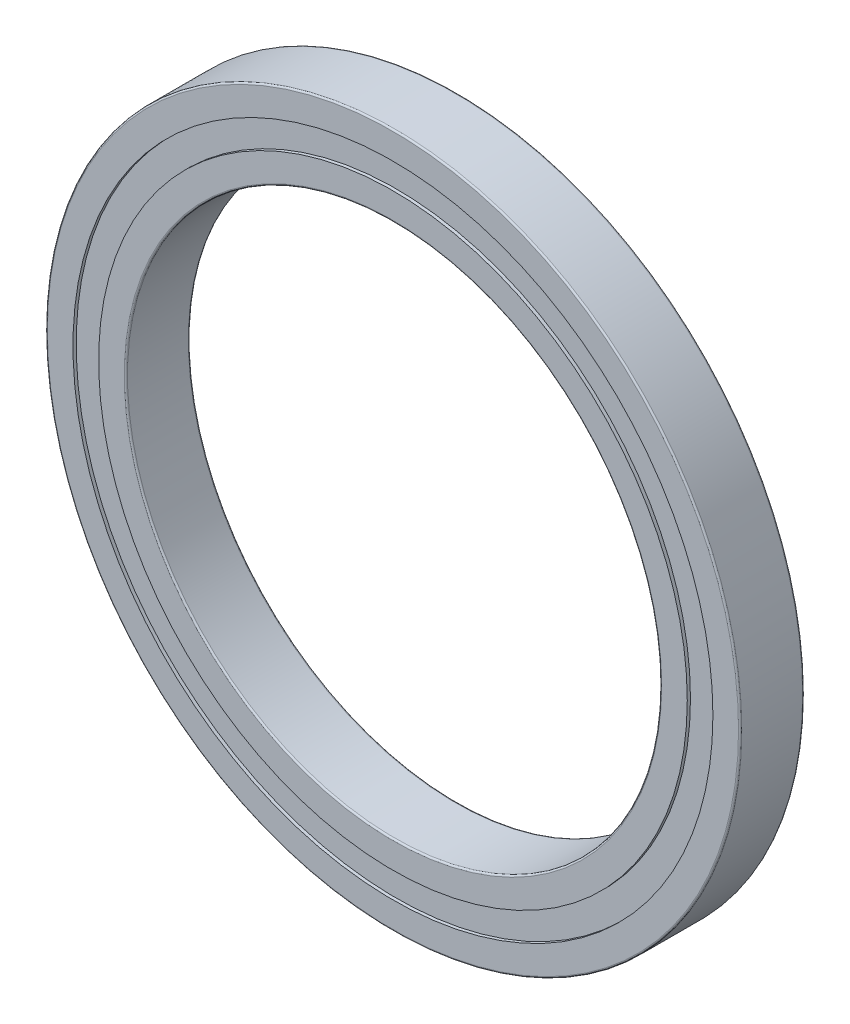
ISO-10303-21;
HEADER;
FILE_DESCRIPTION(('STEP AP214'),'2;1');
FILE_NAME('part.step','',(''),(''),'','','');
FILE_SCHEMA(('AUTOMOTIVE_DESIGN { 1 0 10303 214 1 1 1 1 }'));
ENDSEC;
DATA;
#1=APPLICATION_CONTEXT('core data for automotive mechanical design processes');
#2=APPLICATION_PROTOCOL_DEFINITION('international standard','automotive_design',2000,#1);
#3=PRODUCT_CONTEXT('',#1,'mechanical');
#4=PRODUCT('Part','Part','',(#3));
#5=PRODUCT_RELATED_PRODUCT_CATEGORY('part','',(#4));
#6=PRODUCT_DEFINITION_FORMATION('','',#4);
#7=PRODUCT_DEFINITION_CONTEXT('part definition',#1,'design');
#8=PRODUCT_DEFINITION('design','',#6,#7);
#9=PRODUCT_DEFINITION_SHAPE('','',#8);
#10=(LENGTH_UNIT() NAMED_UNIT(*) SI_UNIT(.MILLI.,.METRE.));
#11=(NAMED_UNIT(*) PLANE_ANGLE_UNIT() SI_UNIT($,.RADIAN.));
#12=(NAMED_UNIT(*) SI_UNIT($,.STERADIAN.) SOLID_ANGLE_UNIT());
#13=UNCERTAINTY_MEASURE_WITH_UNIT(LENGTH_MEASURE(1.E-05),#10,'distance_accuracy_value','');
#14=(GEOMETRIC_REPRESENTATION_CONTEXT(3) GLOBAL_UNCERTAINTY_ASSIGNED_CONTEXT((#13)) GLOBAL_UNIT_ASSIGNED_CONTEXT((#10,
#11,#12)) REPRESENTATION_CONTEXT('',''));
#15=CARTESIAN_POINT('',(0.,0.,0.));
#16=DIRECTION('',(0.,0.,1.));
#17=DIRECTION('',(1.,0.,0.));
#18=AXIS2_PLACEMENT_3D('',#15,#16,#17);
#19=CARTESIAN_POINT('',(0.,0.,0.));
#20=DIRECTION('',(0.,0.,1.));
#21=DIRECTION('',(1.,0.,0.));
#22=AXIS2_PLACEMENT_3D('',#19,#20,#21);
#23=PLANE('',#22);
#24=CARTESIAN_POINT('',(0.,0.,0.));
#25=DIRECTION('',(0.,0.,1.));
#26=DIRECTION('',(1.,0.,0.));
#27=AXIS2_PLACEMENT_3D('',#24,#25,#26);
#28=CIRCLE('',#27,25.15);
#29=CARTESIAN_POINT('',(25.15,0.,0.));
#30=VERTEX_POINT('',#29);
#31=EDGE_CURVE('E62',#30,#30,#28,.T.);
#32=ORIENTED_EDGE('',*,*,#31,.T.);
#33=EDGE_LOOP('',(#32));
#34=FACE_BOUND('',#33,.T.);
#35=CARTESIAN_POINT('',(0.,0.,0.));
#36=DIRECTION('',(0.,0.,1.));
#37=DIRECTION('',(1.,0.,0.));
#38=AXIS2_PLACEMENT_3D('',#35,#36,#37);
#39=CIRCLE('',#38,27.55);
#40=CARTESIAN_POINT('',(27.55,0.,0.));
#41=VERTEX_POINT('',#40);
#42=EDGE_CURVE('E84',#41,#41,#39,.T.);
#43=ORIENTED_EDGE('',*,*,#42,.F.);
#44=EDGE_LOOP('',(#43));
#45=FACE_BOUND('',#44,.T.);
#46=ADVANCED_FACE('F33',(#34,#45),#23,.F.);
#47=CARTESIAN_POINT('',(0.,0.,6.));
#48=DIRECTION('',(0.,0.,1.));
#49=DIRECTION('',(1.,0.,0.));
#50=AXIS2_PLACEMENT_3D('',#47,#48,#49);
#51=PLANE('',#50);
#52=CARTESIAN_POINT('',(0.,0.,6.));
#53=DIRECTION('',(0.,0.,1.));
#54=DIRECTION('',(1.,0.,0.));
#55=AXIS2_PLACEMENT_3D('',#52,#53,#54);
#56=CIRCLE('',#55,25.15);
#57=CARTESIAN_POINT('',(25.15,0.,6.));
#58=VERTEX_POINT('',#57);
#59=EDGE_CURVE('E40',#58,#58,#56,.F.);
#60=ORIENTED_EDGE('',*,*,#59,.T.);
#61=EDGE_LOOP('',(#60));
#62=FACE_BOUND('',#61,.T.);
#63=CARTESIAN_POINT('',(0.,0.,6.));
#64=DIRECTION('',(0.,0.,1.));
#65=DIRECTION('',(1.,0.,0.));
#66=AXIS2_PLACEMENT_3D('',#63,#64,#65);
#67=CIRCLE('',#66,27.55);
#68=CARTESIAN_POINT('',(27.55,0.,6.));
#69=VERTEX_POINT('',#68);
#70=EDGE_CURVE('E72',#69,#69,#67,.T.);
#71=ORIENTED_EDGE('',*,*,#70,.T.);
#72=EDGE_LOOP('',(#71));
#73=FACE_BOUND('',#72,.T.);
#74=ADVANCED_FACE('F101',(#62,#73),#51,.T.);
#75=CARTESIAN_POINT('',(0.,0.,6.));
#76=DIRECTION('',(0.,0.,1.));
#77=DIRECTION('',(1.,0.,0.));
#78=AXIS2_PLACEMENT_3D('',#75,#76,#77);
#79=CIRCLE('',#78,32.35);
#80=CARTESIAN_POINT('',(32.35,0.,6.));
#81=VERTEX_POINT('',#80);
#82=EDGE_CURVE('E10',#81,#81,#79,.T.);
#83=ORIENTED_EDGE('',*,*,#82,.T.);
#84=EDGE_LOOP('',(#83));
#85=FACE_BOUND('',#84,.T.);
#86=CARTESIAN_POINT('',(0.,0.,6.));
#87=DIRECTION('',(0.,0.,1.));
#88=DIRECTION('',(1.,0.,0.));
#89=AXIS2_PLACEMENT_3D('',#86,#87,#88);
#90=CIRCLE('',#89,29.95);
#91=CARTESIAN_POINT('',(29.95,0.,6.));
#92=VERTEX_POINT('',#91);
#93=EDGE_CURVE('E66',#92,#92,#90,.T.);
#94=ORIENTED_EDGE('',*,*,#93,.F.);
#95=EDGE_LOOP('',(#94));
#96=FACE_BOUND('',#95,.T.);
#97=ADVANCED_FACE('F108',(#85,#96),#51,.T.);
#98=CARTESIAN_POINT('',(0.,0.,0.));
#99=DIRECTION('',(0.,0.,1.));
#100=DIRECTION('',(1.,0.,0.));
#101=AXIS2_PLACEMENT_3D('',#98,#99,#100);
#102=CIRCLE('',#101,32.35);
#103=CARTESIAN_POINT('',(32.35,0.,0.));
#104=VERTEX_POINT('',#103);
#105=EDGE_CURVE('E44',#104,#104,#102,.F.);
#106=ORIENTED_EDGE('',*,*,#105,.T.);
#107=EDGE_LOOP('',(#106));
#108=FACE_BOUND('',#107,.T.);
#109=CARTESIAN_POINT('',(0.,0.,0.));
#110=DIRECTION('',(0.,0.,1.));
#111=DIRECTION('',(1.,0.,0.));
#112=AXIS2_PLACEMENT_3D('',#109,#110,#111);
#113=CIRCLE('',#112,29.95);
#114=CARTESIAN_POINT('',(29.95,0.,0.));
#115=VERTEX_POINT('',#114);
#116=EDGE_CURVE('E78',#115,#115,#113,.T.);
#117=ORIENTED_EDGE('',*,*,#116,.T.);
#118=EDGE_LOOP('',(#117));
#119=FACE_BOUND('',#118,.T.);
#120=ADVANCED_FACE('F104',(#108,#119),#23,.F.);
#121=CARTESIAN_POINT('',(0.,0.,6.));
#122=DIRECTION('',(0.,0.,-1.));
#123=DIRECTION('',(-1.,0.,0.));
#124=AXIS2_PLACEMENT_3D('',#121,#122,#123);
#125=CYLINDRICAL_SURFACE('',#124,32.5);
#126=CARTESIAN_POINT('',(0.,0.,0.15));
#127=DIRECTION('',(0.,0.,1.));
#128=DIRECTION('',(1.,0.,0.));
#129=AXIS2_PLACEMENT_3D('',#126,#127,#128);
#130=CIRCLE('',#129,32.5);
#131=CARTESIAN_POINT('',(32.5,0.,0.15));
#132=VERTEX_POINT('',#131);
#133=EDGE_CURVE('E48',#132,#132,#130,.T.);
#134=ORIENTED_EDGE('',*,*,#133,.T.);
#135=EDGE_LOOP('',(#134));
#136=FACE_BOUND('',#135,.T.);
#137=CARTESIAN_POINT('',(0.,0.,5.85));
#138=DIRECTION('',(0.,0.,1.));
#139=DIRECTION('',(1.,0.,0.));
#140=AXIS2_PLACEMENT_3D('',#137,#138,#139);
#141=CIRCLE('',#140,32.5);
#142=CARTESIAN_POINT('',(32.5,0.,5.85));
#143=VERTEX_POINT('',#142);
#144=EDGE_CURVE('E53',#143,#143,#141,.F.);
#145=ORIENTED_EDGE('',*,*,#144,.T.);
#146=EDGE_LOOP('',(#145));
#147=FACE_BOUND('',#146,.T.);
#148=ADVANCED_FACE('F112',(#136,#147),#125,.T.);
#149=CARTESIAN_POINT('',(0.,0.,6.));
#150=DIRECTION('',(0.,0.,-1.));
#151=DIRECTION('',(-1.,0.,0.));
#152=AXIS2_PLACEMENT_3D('',#149,#150,#151);
#153=CYLINDRICAL_SURFACE('',#152,25.);
#154=CARTESIAN_POINT('',(0.,0.,0.15));
#155=DIRECTION('',(0.,0.,1.));
#156=DIRECTION('',(1.,0.,0.));
#157=AXIS2_PLACEMENT_3D('',#154,#155,#156);
#158=CIRCLE('',#157,25.);
#159=CARTESIAN_POINT('',(25.,0.,0.15));
#160=VERTEX_POINT('',#159);
#161=EDGE_CURVE('E56',#160,#160,#158,.F.);
#162=ORIENTED_EDGE('',*,*,#161,.T.);
#163=EDGE_LOOP('',(#162));
#164=FACE_BOUND('',#163,.T.);
#165=CARTESIAN_POINT('',(0.,0.,5.85));
#166=DIRECTION('',(0.,0.,1.));
#167=DIRECTION('',(1.,0.,0.));
#168=AXIS2_PLACEMENT_3D('',#165,#166,#167);
#169=CIRCLE('',#168,25.);
#170=CARTESIAN_POINT('',(25.,0.,5.85));
#171=VERTEX_POINT('',#170);
#172=EDGE_CURVE('E59',#171,#171,#169,.T.);
#173=ORIENTED_EDGE('',*,*,#172,.T.);
#174=EDGE_LOOP('',(#173));
#175=FACE_BOUND('',#174,.T.);
#176=ADVANCED_FACE('F118',(#164,#175),#153,.F.);
#177=CARTESIAN_POINT('',(0.,0.,5.7));
#178=DIRECTION('',(0.,0.,1.));
#179=DIRECTION('',(1.,0.,0.));
#180=AXIS2_PLACEMENT_3D('',#177,#178,#179);
#181=CYLINDRICAL_SURFACE('',#180,29.95);
#182=CARTESIAN_POINT('',(0.,0.,5.7));
#183=DIRECTION('',(0.,0.,1.));
#184=DIRECTION('',(1.,0.,0.));
#185=AXIS2_PLACEMENT_3D('',#182,#183,#184);
#186=CIRCLE('',#185,29.95);
#187=CARTESIAN_POINT('',(29.95,0.,5.7));
#188=VERTEX_POINT('',#187);
#189=EDGE_CURVE('E65',#188,#188,#186,.T.);
#190=ORIENTED_EDGE('',*,*,#189,.F.);
#191=EDGE_LOOP('',(#190));
#192=FACE_BOUND('',#191,.T.);
#193=ORIENTED_EDGE('',*,*,#93,.T.);
#194=EDGE_LOOP('',(#193));
#195=FACE_BOUND('',#194,.T.);
#196=ADVANCED_FACE('F140',(#192,#195),#181,.F.);
#197=CARTESIAN_POINT('',(0.,0.,5.7));
#198=DIRECTION('',(0.,0.,1.));
#199=DIRECTION('',(1.,0.,0.));
#200=AXIS2_PLACEMENT_3D('',#197,#198,#199);
#201=PLANE('',#200);
#202=CARTESIAN_POINT('',(0.,0.,5.7));
#203=DIRECTION('',(0.,0.,1.));
#204=DIRECTION('',(1.,0.,0.));
#205=AXIS2_PLACEMENT_3D('',#202,#203,#204);
#206=CIRCLE('',#205,27.55);
#207=CARTESIAN_POINT('',(27.55,0.,5.7));
#208=VERTEX_POINT('',#207);
#209=EDGE_CURVE('E69',#208,#208,#206,.T.);
#210=ORIENTED_EDGE('',*,*,#209,.F.);
#211=EDGE_LOOP('',(#210));
#212=FACE_BOUND('',#211,.T.);
#213=ORIENTED_EDGE('',*,*,#189,.T.);
#214=EDGE_LOOP('',(#213));
#215=FACE_BOUND('',#214,.T.);
#216=ADVANCED_FACE('F136',(#212,#215),#201,.T.);
#217=CARTESIAN_POINT('',(0.,0.,5.7));
#218=DIRECTION('',(0.,0.,1.));
#219=DIRECTION('',(1.,0.,0.));
#220=AXIS2_PLACEMENT_3D('',#217,#218,#219);
#221=CYLINDRICAL_SURFACE('',#220,27.55);
#222=ORIENTED_EDGE('',*,*,#209,.T.);
#223=EDGE_LOOP('',(#222));
#224=FACE_BOUND('',#223,.T.);
#225=ORIENTED_EDGE('',*,*,#70,.F.);
#226=EDGE_LOOP('',(#225));
#227=FACE_BOUND('',#226,.T.);
#228=ADVANCED_FACE('F130',(#224,#227),#221,.T.);
#229=CARTESIAN_POINT('',(0.,0.,0.5));
#230=DIRECTION('',(0.,0.,1.));
#231=DIRECTION('',(1.,0.,0.));
#232=AXIS2_PLACEMENT_3D('',#229,#230,#231);
#233=PLANE('',#232);
#234=CARTESIAN_POINT('',(0.,0.,0.5));
#235=DIRECTION('',(0.,0.,1.));
#236=DIRECTION('',(1.,0.,0.));
#237=AXIS2_PLACEMENT_3D('',#234,#235,#236);
#238=CIRCLE('',#237,29.95);
#239=CARTESIAN_POINT('',(29.95,0.,0.5));
#240=VERTEX_POINT('',#239);
#241=EDGE_CURVE('E75',#240,#240,#238,.T.);
#242=ORIENTED_EDGE('',*,*,#241,.F.);
#243=EDGE_LOOP('',(#242));
#244=FACE_BOUND('',#243,.T.);
#245=CARTESIAN_POINT('',(0.,0.,0.5));
#246=DIRECTION('',(0.,0.,1.));
#247=DIRECTION('',(1.,0.,0.));
#248=AXIS2_PLACEMENT_3D('',#245,#246,#247);
#249=CIRCLE('',#248,27.55);
#250=CARTESIAN_POINT('',(27.55,0.,0.5));
#251=VERTEX_POINT('',#250);
#252=EDGE_CURVE('E81',#251,#251,#249,.T.);
#253=ORIENTED_EDGE('',*,*,#252,.T.);
#254=EDGE_LOOP('',(#253));
#255=FACE_BOUND('',#254,.T.);
#256=ADVANCED_FACE('F90',(#244,#255),#233,.F.);
#257=CARTESIAN_POINT('',(0.,0.,0.5));
#258=DIRECTION('',(0.,0.,-1.));
#259=DIRECTION('',(-1.,0.,0.));
#260=AXIS2_PLACEMENT_3D('',#257,#258,#259);
#261=CYLINDRICAL_SURFACE('',#260,29.95);
#262=ORIENTED_EDGE('',*,*,#241,.T.);
#263=EDGE_LOOP('',(#262));
#264=FACE_BOUND('',#263,.T.);
#265=ORIENTED_EDGE('',*,*,#116,.F.);
#266=EDGE_LOOP('',(#265));
#267=FACE_BOUND('',#266,.T.);
#268=ADVANCED_FACE('F96',(#264,#267),#261,.F.);
#269=CARTESIAN_POINT('',(0.,0.,0.5));
#270=DIRECTION('',(0.,0.,-1.));
#271=DIRECTION('',(-1.,0.,0.));
#272=AXIS2_PLACEMENT_3D('',#269,#270,#271);
#273=CYLINDRICAL_SURFACE('',#272,27.55);
#274=ORIENTED_EDGE('',*,*,#252,.F.);
#275=EDGE_LOOP('',(#274));
#276=FACE_BOUND('',#275,.T.);
#277=ORIENTED_EDGE('',*,*,#42,.T.);
#278=EDGE_LOOP('',(#277));
#279=FACE_BOUND('',#278,.T.);
#280=ADVANCED_FACE('F92',(#276,#279),#273,.T.);
#281=CARTESIAN_POINT('',(0.,0.,0.15));
#282=DIRECTION('',(0.,0.,1.));
#283=DIRECTION('',(1.,0.,0.));
#284=AXIS2_PLACEMENT_3D('',#281,#282,#283);
#285=TOROIDAL_SURFACE('',#284,25.15,0.15);
#286=ORIENTED_EDGE('',*,*,#161,.F.);
#287=EDGE_LOOP('',(#286));
#288=FACE_BOUND('',#287,.T.);
#289=ORIENTED_EDGE('',*,*,#31,.F.);
#290=EDGE_LOOP('',(#289));
#291=FACE_BOUND('',#290,.T.);
#292=ADVANCED_FACE('F95',(#288,#291),#285,.T.);
#293=CARTESIAN_POINT('',(0.,0.,0.15));
#294=DIRECTION('',(0.,0.,1.));
#295=DIRECTION('',(1.,0.,0.));
#296=AXIS2_PLACEMENT_3D('',#293,#294,#295);
#297=TOROIDAL_SURFACE('',#296,32.35,0.15);
#298=ORIENTED_EDGE('',*,*,#105,.F.);
#299=EDGE_LOOP('',(#298));
#300=FACE_BOUND('',#299,.T.);
#301=ORIENTED_EDGE('',*,*,#133,.F.);
#302=EDGE_LOOP('',(#301));
#303=FACE_BOUND('',#302,.T.);
#304=ADVANCED_FACE('F155',(#300,#303),#297,.T.);
#305=CARTESIAN_POINT('',(0.,0.,5.85));
#306=DIRECTION('',(0.,0.,1.));
#307=DIRECTION('',(1.,0.,0.));
#308=AXIS2_PLACEMENT_3D('',#305,#306,#307);
#309=TOROIDAL_SURFACE('',#308,25.15,0.15);
#310=ORIENTED_EDGE('',*,*,#59,.F.);
#311=EDGE_LOOP('',(#310));
#312=FACE_BOUND('',#311,.T.);
#313=ORIENTED_EDGE('',*,*,#172,.F.);
#314=EDGE_LOOP('',(#313));
#315=FACE_BOUND('',#314,.T.);
#316=ADVANCED_FACE('F153',(#312,#315),#309,.T.);
#317=CARTESIAN_POINT('',(0.,0.,5.85));
#318=DIRECTION('',(0.,0.,1.));
#319=DIRECTION('',(1.,0.,0.));
#320=AXIS2_PLACEMENT_3D('',#317,#318,#319);
#321=TOROIDAL_SURFACE('',#320,32.35,0.15);
#322=ORIENTED_EDGE('',*,*,#144,.F.);
#323=EDGE_LOOP('',(#322));
#324=FACE_BOUND('',#323,.T.);
#325=ORIENTED_EDGE('',*,*,#82,.F.);
#326=EDGE_LOOP('',(#325));
#327=FACE_BOUND('',#326,.T.);
#328=ADVANCED_FACE('F35',(#324,#327),#321,.T.);
#329=CLOSED_SHELL('',(#46,#74,#97,#120,#148,#176,#196,#216,#228,#256,#268,#280,#292,#304,#316,#328));
#330=MANIFOLD_SOLID_BREP('B2',#329);
#331=ADVANCED_BREP_SHAPE_REPRESENTATION('',(#18,#330),#14);
#332=SHAPE_DEFINITION_REPRESENTATION(#9,#331);
ENDSEC;
END-ISO-10303-21;
